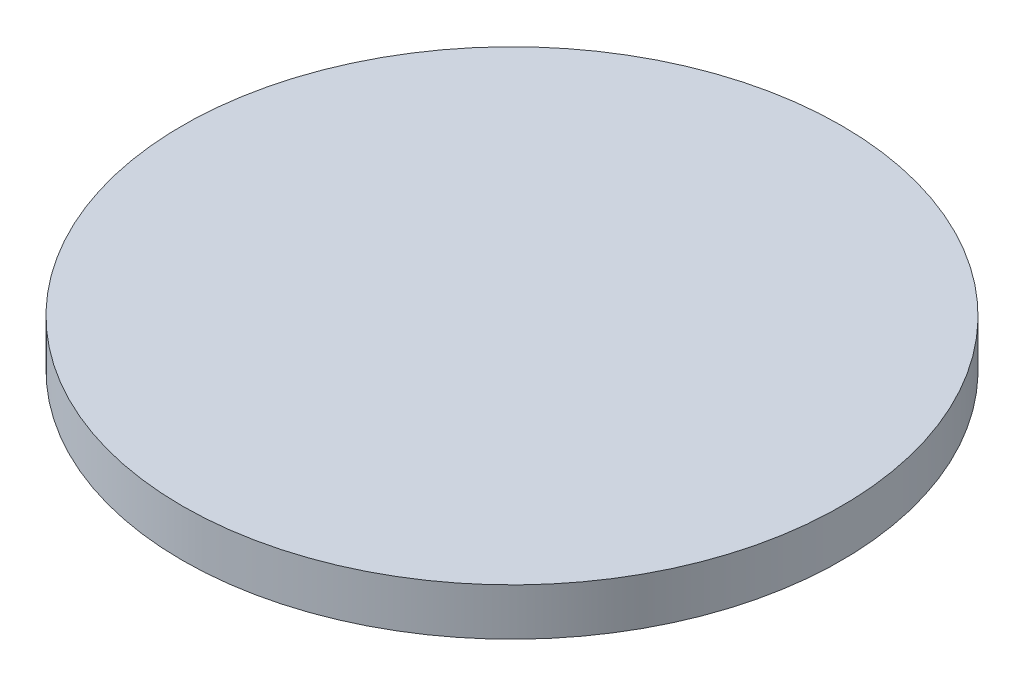
ISO-10303-21;
HEADER;
FILE_DESCRIPTION(('STEP AP214'),'2;1');
FILE_NAME('part.step','',(''),(''),'','','');
FILE_SCHEMA(('AUTOMOTIVE_DESIGN { 1 0 10303 214 1 1 1 1 }'));
ENDSEC;
DATA;
#1=APPLICATION_CONTEXT('core data for automotive mechanical design processes');
#2=APPLICATION_PROTOCOL_DEFINITION('international standard','automotive_design',2000,#1);
#3=PRODUCT_CONTEXT('',#1,'mechanical');
#4=PRODUCT('Part','Part','',(#3));
#5=PRODUCT_RELATED_PRODUCT_CATEGORY('part','',(#4));
#6=PRODUCT_DEFINITION_FORMATION('','',#4);
#7=PRODUCT_DEFINITION_CONTEXT('part definition',#1,'design');
#8=PRODUCT_DEFINITION('design','',#6,#7);
#9=PRODUCT_DEFINITION_SHAPE('','',#8);
#10=(LENGTH_UNIT() NAMED_UNIT(*) SI_UNIT(.MILLI.,.METRE.));
#11=(NAMED_UNIT(*) PLANE_ANGLE_UNIT() SI_UNIT($,.RADIAN.));
#12=(NAMED_UNIT(*) SI_UNIT($,.STERADIAN.) SOLID_ANGLE_UNIT());
#13=UNCERTAINTY_MEASURE_WITH_UNIT(LENGTH_MEASURE(1.E-05),#10,'distance_accuracy_value','');
#14=(GEOMETRIC_REPRESENTATION_CONTEXT(3) GLOBAL_UNCERTAINTY_ASSIGNED_CONTEXT((#13)) GLOBAL_UNIT_ASSIGNED_CONTEXT((#10,
#11,#12)) REPRESENTATION_CONTEXT('',''));
#15=CARTESIAN_POINT('',(0.,0.,0.));
#16=DIRECTION('',(0.,0.,1.));
#17=DIRECTION('',(1.,0.,0.));
#18=AXIS2_PLACEMENT_3D('',#15,#16,#17);
#19=CARTESIAN_POINT('',(0.,6.35,0.));
#20=DIRECTION('',(0.,-1.,0.));
#21=DIRECTION('',(0.,0.,-1.));
#22=AXIS2_PLACEMENT_3D('',#19,#20,#21);
#23=CYLINDRICAL_SURFACE('',#22,44.45);
#24=CARTESIAN_POINT('',(0.,6.35,0.));
#25=DIRECTION('',(0.,1.,0.));
#26=DIRECTION('',(0.,0.,1.));
#27=AXIS2_PLACEMENT_3D('',#24,#25,#26);
#28=CIRCLE('',#27,44.45);
#29=CARTESIAN_POINT('',(0.,6.35,44.45));
#30=VERTEX_POINT('',#29);
#31=EDGE_CURVE('E10',#30,#30,#28,.T.);
#32=ORIENTED_EDGE('',*,*,#31,.F.);
#33=EDGE_LOOP('',(#32));
#34=FACE_BOUND('',#33,.T.);
#35=CARTESIAN_POINT('',(0.,0.,0.));
#36=DIRECTION('',(0.,1.,0.));
#37=DIRECTION('',(0.,0.,1.));
#38=AXIS2_PLACEMENT_3D('',#35,#36,#37);
#39=CIRCLE('',#38,44.45);
#40=CARTESIAN_POINT('',(0.,0.,44.45));
#41=VERTEX_POINT('',#40);
#42=EDGE_CURVE('E37',#41,#41,#39,.T.);
#43=ORIENTED_EDGE('',*,*,#42,.T.);
#44=EDGE_LOOP('',(#43));
#45=FACE_BOUND('',#44,.T.);
#46=ADVANCED_FACE('F40',(#34,#45),#23,.T.);
#47=CARTESIAN_POINT('',(0.,6.35,0.));
#48=DIRECTION('',(0.,1.,0.));
#49=DIRECTION('',(0.,0.,1.));
#50=AXIS2_PLACEMENT_3D('',#47,#48,#49);
#51=PLANE('',#50);
#52=ORIENTED_EDGE('',*,*,#31,.T.);
#53=EDGE_LOOP('',(#52));
#54=FACE_BOUND('',#53,.T.);
#55=ADVANCED_FACE('F55',(#54),#51,.T.);
#56=CARTESIAN_POINT('',(0.,0.,0.));
#57=DIRECTION('',(0.,1.,0.));
#58=DIRECTION('',(0.,0.,1.));
#59=AXIS2_PLACEMENT_3D('',#56,#57,#58);
#60=PLANE('',#59);
#61=ORIENTED_EDGE('',*,*,#42,.F.);
#62=EDGE_LOOP('',(#61));
#63=FACE_BOUND('',#62,.T.);
#64=ADVANCED_FACE('F49',(#63),#60,.F.);
#65=CLOSED_SHELL('',(#46,#55,#64));
#66=MANIFOLD_SOLID_BREP('B2',#65);
#67=ADVANCED_BREP_SHAPE_REPRESENTATION('',(#18,#66),#14);
#68=SHAPE_DEFINITION_REPRESENTATION(#9,#67);
ENDSEC;
END-ISO-10303-21;
